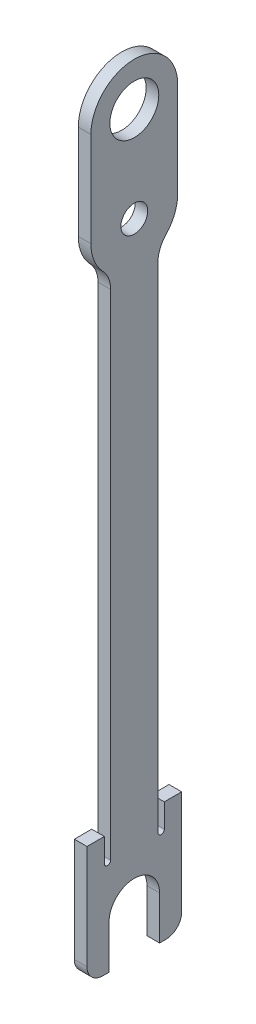
ISO-10303-21;
HEADER;
FILE_DESCRIPTION(('STEP AP214'),'2;1');
FILE_NAME('part.step','',(''),(''),'','','');
FILE_SCHEMA(('AUTOMOTIVE_DESIGN { 1 0 10303 214 1 1 1 1 }'));
ENDSEC;
DATA;
#1=APPLICATION_CONTEXT('core data for automotive mechanical design processes');
#2=APPLICATION_PROTOCOL_DEFINITION('international standard','automotive_design',2000,#1);
#3=PRODUCT_CONTEXT('',#1,'mechanical');
#4=PRODUCT('Part','Part','',(#3));
#5=PRODUCT_RELATED_PRODUCT_CATEGORY('part','',(#4));
#6=PRODUCT_DEFINITION_FORMATION('','',#4);
#7=PRODUCT_DEFINITION_CONTEXT('part definition',#1,'design');
#8=PRODUCT_DEFINITION('design','',#6,#7);
#9=PRODUCT_DEFINITION_SHAPE('','',#8);
#10=(LENGTH_UNIT() NAMED_UNIT(*) SI_UNIT(.MILLI.,.METRE.));
#11=(NAMED_UNIT(*) PLANE_ANGLE_UNIT() SI_UNIT($,.RADIAN.));
#12=(NAMED_UNIT(*) SI_UNIT($,.STERADIAN.) SOLID_ANGLE_UNIT());
#13=UNCERTAINTY_MEASURE_WITH_UNIT(LENGTH_MEASURE(1.E-05),#10,'distance_accuracy_value','');
#14=(GEOMETRIC_REPRESENTATION_CONTEXT(3) GLOBAL_UNCERTAINTY_ASSIGNED_CONTEXT((#13)) GLOBAL_UNIT_ASSIGNED_CONTEXT((#10,
#11,#12)) REPRESENTATION_CONTEXT('',''));
#15=CARTESIAN_POINT('',(0.,0.,0.));
#16=DIRECTION('',(0.,0.,1.));
#17=DIRECTION('',(1.,0.,0.));
#18=AXIS2_PLACEMENT_3D('',#15,#16,#17);
#19=CARTESIAN_POINT('',(0.800000000000043,12.43,1.5));
#20=DIRECTION('',(0.,0.,-1.));
#21=DIRECTION('',(1.,0.,0.));
#22=AXIS2_PLACEMENT_3D('',#19,#20,#21);
#23=PLANE('',#22);
#24=DIRECTION('',(0.,-1.,0.));
#25=VECTOR('',#24,1.);
#26=CARTESIAN_POINT('',(0.800000000000127,18.43,1.5));
#27=LINE('',#26,#25);
#28=CARTESIAN_POINT('',(0.800000000000251,36.6175089784646,1.5));
#29=VERTEX_POINT('',#28);
#30=CARTESIAN_POINT('',(0.8,5.3,1.5));
#31=VERTEX_POINT('',#30);
#32=EDGE_CURVE('E13',#29,#31,#27,.T.);
#33=ORIENTED_EDGE('',*,*,#32,.F.);
#34=DIRECTION('',(-1.,0.,0.));
#35=VECTOR('',#34,1.);
#36=CARTESIAN_POINT('',(2.4980018054066E-13,36.6175089784646,1.5));
#37=LINE('',#36,#35);
#38=CARTESIAN_POINT('',(2.4980018054066E-13,36.6175089784646,1.5));
#39=VERTEX_POINT('',#38);
#40=EDGE_CURVE('E457',#29,#39,#37,.T.);
#41=ORIENTED_EDGE('',*,*,#40,.T.);
#42=DIRECTION('',(0.,1.,0.));
#43=VECTOR('',#42,1.);
#44=CARTESIAN_POINT('',(0.,12.43,1.5));
#45=LINE('',#44,#43);
#46=CARTESIAN_POINT('',(0.,5.3,1.5));
#47=VERTEX_POINT('',#46);
#48=EDGE_CURVE('E257',#39,#47,#45,.F.);
#49=ORIENTED_EDGE('',*,*,#48,.T.);
#50=DIRECTION('',(1.,0.,0.));
#51=VECTOR('',#50,1.);
#52=CARTESIAN_POINT('',(0.,5.3,1.5));
#53=LINE('',#52,#51);
#54=EDGE_CURVE('E515',#47,#31,#53,.T.);
#55=ORIENTED_EDGE('',*,*,#54,.T.);
#56=EDGE_LOOP('',(#33,#41,#49,#55));
#57=FACE_BOUND('',#56,.T.);
#58=ADVANCED_FACE('F253',(#57),#23,.F.);
#59=CARTESIAN_POINT('',(0.800000000000127,18.43,0.));
#60=DIRECTION('',(-1.,0.,0.));
#61=DIRECTION('',(0.,-1.,0.));
#62=AXIS2_PLACEMENT_3D('',#59,#60,#61);
#63=PLANE('',#62);
#64=DIRECTION('',(0.,-1.,0.));
#65=VECTOR('',#64,1.);
#66=CARTESIAN_POINT('',(0.800000000000127,18.43,-1.5));
#67=LINE('',#66,#65);
#68=CARTESIAN_POINT('',(0.800000000000251,36.6175089784646,-1.5));
#69=VERTEX_POINT('',#68);
#70=CARTESIAN_POINT('',(0.8,5.3,-1.5));
#71=VERTEX_POINT('',#70);
#72=EDGE_CURVE('E270',#69,#71,#67,.T.);
#73=ORIENTED_EDGE('',*,*,#72,.F.);
#74=CARTESIAN_POINT('',(0.800000000000251,36.6175089784646,-3.3));
#75=DIRECTION('',(-1.,0.,0.));
#76=DIRECTION('',(0.,1.,0.));
#77=AXIS2_PLACEMENT_3D('',#74,#75,#76);
#78=CIRCLE('',#77,1.8);
#79=CARTESIAN_POINT('',(0.800000000000259,37.8567361957753,-1.99450549450549));
#80=VERTEX_POINT('',#79);
#81=EDGE_CURVE('E503',#80,#69,#78,.F.);
#82=ORIENTED_EDGE('',*,*,#81,.F.);
#83=CARTESIAN_POINT('',(0.800000000000272,39.75,0.));
#84=DIRECTION('',(-1.,0.,0.));
#85=DIRECTION('',(0.,1.,0.));
#86=AXIS2_PLACEMENT_3D('',#83,#84,#85);
#87=CIRCLE('',#86,2.75);
#88=CARTESIAN_POINT('',(0.800000000000282,39.75,-2.75));
#89=VERTEX_POINT('',#88);
#90=EDGE_CURVE('E490',#89,#80,#87,.T.);
#91=ORIENTED_EDGE('',*,*,#90,.F.);
#92=DIRECTION('',(0.,-1.,0.));
#93=VECTOR('',#92,1.);
#94=CARTESIAN_POINT('',(0.800000000000334,48.5,-2.74999999999999));
#95=LINE('',#94,#93);
#96=CARTESIAN_POINT('',(0.800000000000325,45.75,-2.75));
#97=VERTEX_POINT('',#96);
#98=EDGE_CURVE('E454',#89,#97,#95,.F.);
#99=ORIENTED_EDGE('',*,*,#98,.T.);
#100=CARTESIAN_POINT('',(0.800000000000314,45.75,0.));
#101=DIRECTION('',(1.,0.,0.));
#102=DIRECTION('',(0.,1.,0.));
#103=AXIS2_PLACEMENT_3D('',#100,#101,#102);
#104=CIRCLE('',#103,2.75);
#105=CARTESIAN_POINT('',(0.800000000000323,45.75,2.75));
#106=VERTEX_POINT('',#105);
#107=EDGE_CURVE('E451',#97,#106,#104,.T.);
#108=ORIENTED_EDGE('',*,*,#107,.T.);
#109=DIRECTION('',(0.,-1.,0.));
#110=VECTOR('',#109,1.);
#111=CARTESIAN_POINT('',(0.800000000000334,48.5,2.74999999999999));
#112=LINE('',#111,#110);
#113=CARTESIAN_POINT('',(0.80000000000028,39.75,2.75));
#114=VERTEX_POINT('',#113);
#115=EDGE_CURVE('E512',#114,#106,#112,.F.);
#116=ORIENTED_EDGE('',*,*,#115,.F.);
#117=CARTESIAN_POINT('',(0.800000000000272,39.75,0.));
#118=DIRECTION('',(1.,0.,0.));
#119=DIRECTION('',(0.,1.,0.));
#120=AXIS2_PLACEMENT_3D('',#117,#118,#119);
#121=CIRCLE('',#120,2.75);
#122=CARTESIAN_POINT('',(0.800000000000259,37.8567361957753,1.99450549450549));
#123=VERTEX_POINT('',#122);
#124=EDGE_CURVE('E319',#114,#123,#121,.T.);
#125=ORIENTED_EDGE('',*,*,#124,.T.);
#126=CARTESIAN_POINT('',(0.800000000000251,36.6175089784646,3.3));
#127=DIRECTION('',(1.,0.,0.));
#128=DIRECTION('',(0.,1.,0.));
#129=AXIS2_PLACEMENT_3D('',#126,#127,#128);
#130=CIRCLE('',#129,1.8);
#131=EDGE_CURVE('E446',#123,#29,#130,.F.);
#132=ORIENTED_EDGE('',*,*,#131,.T.);
#133=ORIENTED_EDGE('',*,*,#32,.T.);
#134=CARTESIAN_POINT('',(0.8,5.3,1.7));
#135=DIRECTION('',(-1.,0.,0.));
#136=DIRECTION('',(0.,0.,1.));
#137=AXIS2_PLACEMENT_3D('',#134,#135,#136);
#138=CIRCLE('',#137,0.2);
#139=CARTESIAN_POINT('',(0.8,5.3,1.9));
#140=VERTEX_POINT('',#139);
#141=EDGE_CURVE('E575',#140,#31,#138,.F.);
#142=ORIENTED_EDGE('',*,*,#141,.F.);
#143=DIRECTION('',(0.,-1.,0.));
#144=VECTOR('',#143,1.);
#145=CARTESIAN_POINT('',(0.8,-0.8,1.9));
#146=LINE('',#145,#144);
#147=CARTESIAN_POINT('',(0.8,6.8,1.9));
#148=VERTEX_POINT('',#147);
#149=EDGE_CURVE('E568',#148,#140,#146,.T.);
#150=ORIENTED_EDGE('',*,*,#149,.F.);
#151=DIRECTION('',(0.,0.,-1.));
#152=VECTOR('',#151,1.);
#153=CARTESIAN_POINT('',(0.8,6.8,3.));
#154=LINE('',#153,#152);
#155=CARTESIAN_POINT('',(0.8,6.8,3.));
#156=VERTEX_POINT('',#155);
#157=EDGE_CURVE('E563',#156,#148,#154,.T.);
#158=ORIENTED_EDGE('',*,*,#157,.F.);
#159=DIRECTION('',(0.,1.,0.));
#160=VECTOR('',#159,1.);
#161=CARTESIAN_POINT('',(0.8,-0.8,3.));
#162=LINE('',#161,#160);
#163=CARTESIAN_POINT('',(0.8,0.2,3.));
#164=VERTEX_POINT('',#163);
#165=EDGE_CURVE('E556',#164,#156,#162,.T.);
#166=ORIENTED_EDGE('',*,*,#165,.F.);
#167=CARTESIAN_POINT('',(0.8,0.2,2.));
#168=DIRECTION('',(-1.,0.,0.));
#169=DIRECTION('',(0.,0.,1.));
#170=AXIS2_PLACEMENT_3D('',#167,#168,#169);
#171=CIRCLE('',#170,1.);
#172=CARTESIAN_POINT('',(0.8,-0.8,2.));
#173=VERTEX_POINT('',#172);
#174=EDGE_CURVE('E618',#164,#173,#171,.F.);
#175=ORIENTED_EDGE('',*,*,#174,.T.);
#176=DIRECTION('',(0.,0.,-1.));
#177=VECTOR('',#176,1.);
#178=CARTESIAN_POINT('',(0.8,-0.8,3.));
#179=LINE('',#178,#177);
#180=CARTESIAN_POINT('',(0.8,-0.8,1.6));
#181=VERTEX_POINT('',#180);
#182=EDGE_CURVE('E442',#173,#181,#179,.T.);
#183=ORIENTED_EDGE('',*,*,#182,.T.);
#184=DIRECTION('',(0.,-1.,0.));
#185=VECTOR('',#184,1.);
#186=CARTESIAN_POINT('',(0.8,1.95000000000114,1.6));
#187=LINE('',#186,#185);
#188=CARTESIAN_POINT('',(0.8,1.95000000000114,1.6));
#189=VERTEX_POINT('',#188);
#190=EDGE_CURVE('E428',#189,#181,#187,.T.);
#191=ORIENTED_EDGE('',*,*,#190,.F.);
#192=CARTESIAN_POINT('',(0.8,1.95000000000114,0.));
#193=DIRECTION('',(1.,0.,0.));
#194=DIRECTION('',(0.,0.,-1.));
#195=AXIS2_PLACEMENT_3D('',#192,#193,#194);
#196=CIRCLE('',#195,1.6);
#197=CARTESIAN_POINT('',(0.8,1.95000000000114,-1.6));
#198=VERTEX_POINT('',#197);
#199=EDGE_CURVE('E331',#198,#189,#196,.T.);
#200=ORIENTED_EDGE('',*,*,#199,.F.);
#201=DIRECTION('',(0.,-1.,0.));
#202=VECTOR('',#201,1.);
#203=CARTESIAN_POINT('',(0.8,1.95000000000114,-1.6));
#204=LINE('',#203,#202);
#205=CARTESIAN_POINT('',(0.8,-0.8,-1.6));
#206=VERTEX_POINT('',#205);
#207=EDGE_CURVE('E621',#198,#206,#204,.T.);
#208=ORIENTED_EDGE('',*,*,#207,.T.);
#209=DIRECTION('',(0.,0.,1.));
#210=VECTOR('',#209,1.);
#211=CARTESIAN_POINT('',(0.8,-0.8,-3.));
#212=LINE('',#211,#210);
#213=CARTESIAN_POINT('',(0.8,-0.8,-2.));
#214=VERTEX_POINT('',#213);
#215=EDGE_CURVE('E600',#214,#206,#212,.T.);
#216=ORIENTED_EDGE('',*,*,#215,.F.);
#217=CARTESIAN_POINT('',(0.8,0.2,-2.));
#218=DIRECTION('',(1.,0.,0.));
#219=DIRECTION('',(0.,0.,-1.));
#220=AXIS2_PLACEMENT_3D('',#217,#218,#219);
#221=CIRCLE('',#220,1.);
#222=CARTESIAN_POINT('',(0.8,0.2,-3.));
#223=VERTEX_POINT('',#222);
#224=EDGE_CURVE('E597',#223,#214,#221,.F.);
#225=ORIENTED_EDGE('',*,*,#224,.F.);
#226=DIRECTION('',(0.,1.,0.));
#227=VECTOR('',#226,1.);
#228=CARTESIAN_POINT('',(0.8,-0.8,-3.));
#229=LINE('',#228,#227);
#230=CARTESIAN_POINT('',(0.8,6.8,-3.));
#231=VERTEX_POINT('',#230);
#232=EDGE_CURVE('E623',#223,#231,#229,.T.);
#233=ORIENTED_EDGE('',*,*,#232,.T.);
#234=DIRECTION('',(0.,0.,1.));
#235=VECTOR('',#234,1.);
#236=CARTESIAN_POINT('',(0.8,6.8,-3.));
#237=LINE('',#236,#235);
#238=CARTESIAN_POINT('',(0.8,6.8,-1.9));
#239=VERTEX_POINT('',#238);
#240=EDGE_CURVE('E626',#231,#239,#237,.T.);
#241=ORIENTED_EDGE('',*,*,#240,.T.);
#242=DIRECTION('',(0.,-1.,0.));
#243=VECTOR('',#242,1.);
#244=CARTESIAN_POINT('',(0.8,-0.8,-1.9));
#245=LINE('',#244,#243);
#246=CARTESIAN_POINT('',(0.8,5.3,-1.9));
#247=VERTEX_POINT('',#246);
#248=EDGE_CURVE('E629',#239,#247,#245,.T.);
#249=ORIENTED_EDGE('',*,*,#248,.T.);
#250=CARTESIAN_POINT('',(0.8,5.3,-1.7));
#251=DIRECTION('',(1.,0.,0.));
#252=DIRECTION('',(0.,0.,-1.));
#253=AXIS2_PLACEMENT_3D('',#250,#251,#252);
#254=CIRCLE('',#253,0.2);
#255=EDGE_CURVE('E632',#247,#71,#254,.F.);
#256=ORIENTED_EDGE('',*,*,#255,.T.);
#257=EDGE_LOOP('',(#73,#82,#91,#99,#108,#116,#125,#132,#133,#142,#150,#158,#166,#175,#183,#191,
#200,#208,#216,#225,#233,#241,#249,#256));
#258=FACE_BOUND('',#257,.T.);
#259=CARTESIAN_POINT('',(0.800000000000272,39.75,0.));
#260=DIRECTION('',(1.,0.,0.));
#261=DIRECTION('',(0.,1.,0.));
#262=AXIS2_PLACEMENT_3D('',#259,#260,#261);
#263=CIRCLE('',#262,0.85);
#264=CARTESIAN_POINT('',(0.800000000000278,40.6,0.));
#265=VERTEX_POINT('',#264);
#266=EDGE_CURVE('E469',#265,#265,#263,.T.);
#267=ORIENTED_EDGE('',*,*,#266,.F.);
#268=EDGE_LOOP('',(#267));
#269=FACE_BOUND('',#268,.T.);
#270=CARTESIAN_POINT('',(0.800000000000314,45.75,0.));
#271=DIRECTION('',(1.,0.,0.));
#272=DIRECTION('',(0.,1.,0.));
#273=AXIS2_PLACEMENT_3D('',#270,#271,#272);
#274=CIRCLE('',#273,1.55);
#275=CARTESIAN_POINT('',(0.800000000000325,47.3,0.));
#276=VERTEX_POINT('',#275);
#277=EDGE_CURVE('E475',#276,#276,#274,.T.);
#278=ORIENTED_EDGE('',*,*,#277,.F.);
#279=EDGE_LOOP('',(#278));
#280=FACE_BOUND('',#279,.T.);
#281=ADVANCED_FACE('F439',(#258,#269,#280),#63,.F.);
#282=CARTESIAN_POINT('',(0.,-0.8,3.));
#283=DIRECTION('',(-1.,0.,0.));
#284=DIRECTION('',(0.,0.,1.));
#285=AXIS2_PLACEMENT_3D('',#282,#283,#284);
#286=PLANE('',#285);
#287=ORIENTED_EDGE('',*,*,#48,.F.);
#288=CARTESIAN_POINT('',(2.4980018054066E-13,36.6175089784646,3.3));
#289=DIRECTION('',(1.,0.,0.));
#290=DIRECTION('',(0.,1.,0.));
#291=AXIS2_PLACEMENT_3D('',#288,#289,#290);
#292=CIRCLE('',#291,1.8);
#293=CARTESIAN_POINT('',(2.58473797920544E-13,37.8567361957753,1.99450549450549));
#294=VERTEX_POINT('',#293);
#295=EDGE_CURVE('E465',#39,#294,#292,.T.);
#296=ORIENTED_EDGE('',*,*,#295,.T.);
#297=CARTESIAN_POINT('',(2.7148422399037E-13,39.75,0.));
#298=DIRECTION('',(-1.,0.,0.));
#299=DIRECTION('',(0.,-1.,0.));
#300=AXIS2_PLACEMENT_3D('',#297,#298,#299);
#301=CIRCLE('',#300,2.75);
#302=CARTESIAN_POINT('',(2.7148422399037E-13,39.75,2.75));
#303=VERTEX_POINT('',#302);
#304=EDGE_CURVE('E463',#294,#303,#301,.T.);
#305=ORIENTED_EDGE('',*,*,#304,.T.);
#306=DIRECTION('',(0.,1.,0.));
#307=VECTOR('',#306,1.);
#308=CARTESIAN_POINT('',(0.,9.39999999999996,2.75));
#309=LINE('',#308,#307);
#310=CARTESIAN_POINT('',(3.13984949151802E-13,45.75,2.74999999999999));
#311=VERTEX_POINT('',#310);
#312=EDGE_CURVE('E460',#303,#311,#309,.T.);
#313=ORIENTED_EDGE('',*,*,#312,.T.);
#314=CARTESIAN_POINT('',(3.13984949151802E-13,45.75,0.));
#315=DIRECTION('',(-1.,0.,0.));
#316=DIRECTION('',(0.,-1.,0.));
#317=AXIS2_PLACEMENT_3D('',#314,#315,#316);
#318=CIRCLE('',#317,2.75);
#319=CARTESIAN_POINT('',(3.13984949151802E-13,45.75,-2.74999999999999));
#320=VERTEX_POINT('',#319);
#321=EDGE_CURVE('E467',#311,#320,#318,.T.);
#322=ORIENTED_EDGE('',*,*,#321,.T.);
#323=DIRECTION('',(0.,1.,0.));
#324=VECTOR('',#323,1.);
#325=CARTESIAN_POINT('',(0.,9.39999999999996,-2.75));
#326=LINE('',#325,#324);
#327=CARTESIAN_POINT('',(2.7148422399037E-13,39.75,-2.74999999999999));
#328=VERTEX_POINT('',#327);
#329=EDGE_CURVE('E484',#328,#320,#326,.T.);
#330=ORIENTED_EDGE('',*,*,#329,.F.);
#331=CARTESIAN_POINT('',(2.7148422399037E-13,39.75,0.));
#332=DIRECTION('',(1.,0.,0.));
#333=DIRECTION('',(0.,-1.,0.));
#334=AXIS2_PLACEMENT_3D('',#331,#332,#333);
#335=CIRCLE('',#334,2.75);
#336=CARTESIAN_POINT('',(2.58473797920544E-13,37.8567361957753,-1.99450549450549));
#337=VERTEX_POINT('',#336);
#338=EDGE_CURVE('E493',#337,#328,#335,.T.);
#339=ORIENTED_EDGE('',*,*,#338,.F.);
#340=CARTESIAN_POINT('',(2.50667542278649E-13,36.6175089784646,-3.3));
#341=DIRECTION('',(-1.,0.,0.));
#342=DIRECTION('',(0.,1.,0.));
#343=AXIS2_PLACEMENT_3D('',#340,#341,#342);
#344=CIRCLE('',#343,1.8);
#345=CARTESIAN_POINT('',(2.4980018054066E-13,36.6175089784646,-1.5));
#346=VERTEX_POINT('',#345);
#347=EDGE_CURVE('E497',#346,#337,#344,.T.);
#348=ORIENTED_EDGE('',*,*,#347,.F.);
#349=DIRECTION('',(0.,1.,0.));
#350=VECTOR('',#349,1.);
#351=CARTESIAN_POINT('',(0.,12.43,-1.5));
#352=LINE('',#351,#350);
#353=CARTESIAN_POINT('',(0.,5.3,-1.5));
#354=VERTEX_POINT('',#353);
#355=EDGE_CURVE('E449',#346,#354,#352,.F.);
#356=ORIENTED_EDGE('',*,*,#355,.T.);
#357=CARTESIAN_POINT('',(0.,5.3,-1.7));
#358=DIRECTION('',(1.,0.,0.));
#359=DIRECTION('',(0.,0.,-1.));
#360=AXIS2_PLACEMENT_3D('',#357,#358,#359);
#361=CIRCLE('',#360,0.2);
#362=CARTESIAN_POINT('',(0.,5.3,-1.9));
#363=VERTEX_POINT('',#362);
#364=EDGE_CURVE('E523',#354,#363,#361,.T.);
#365=ORIENTED_EDGE('',*,*,#364,.T.);
#366=DIRECTION('',(0.,1.,0.));
#367=VECTOR('',#366,1.);
#368=CARTESIAN_POINT('',(0.,5.3,-1.9));
#369=LINE('',#368,#367);
#370=CARTESIAN_POINT('',(0.,6.8,-1.9));
#371=VERTEX_POINT('',#370);
#372=EDGE_CURVE('E536',#363,#371,#369,.T.);
#373=ORIENTED_EDGE('',*,*,#372,.T.);
#374=DIRECTION('',(0.,0.,1.));
#375=VECTOR('',#374,1.);
#376=CARTESIAN_POINT('',(0.,6.8,-3.));
#377=LINE('',#376,#375);
#378=CARTESIAN_POINT('',(0.,6.8,-3.));
#379=VERTEX_POINT('',#378);
#380=EDGE_CURVE('E583',#379,#371,#377,.T.);
#381=ORIENTED_EDGE('',*,*,#380,.F.);
#382=DIRECTION('',(0.,1.,0.));
#383=VECTOR('',#382,1.);
#384=CARTESIAN_POINT('',(0.,-0.8,-3.));
#385=LINE('',#384,#383);
#386=CARTESIAN_POINT('',(0.,0.2,-3.));
#387=VERTEX_POINT('',#386);
#388=EDGE_CURVE('E588',#387,#379,#385,.T.);
#389=ORIENTED_EDGE('',*,*,#388,.F.);
#390=CARTESIAN_POINT('',(0.,0.2,-2.));
#391=DIRECTION('',(1.,0.,0.));
#392=DIRECTION('',(0.,0.,-1.));
#393=AXIS2_PLACEMENT_3D('',#390,#391,#392);
#394=CIRCLE('',#393,1.);
#395=CARTESIAN_POINT('',(0.,-0.8,-2.));
#396=VERTEX_POINT('',#395);
#397=EDGE_CURVE('E592',#396,#387,#394,.T.);
#398=ORIENTED_EDGE('',*,*,#397,.F.);
#399=DIRECTION('',(0.,0.,1.));
#400=VECTOR('',#399,1.);
#401=CARTESIAN_POINT('',(0.,-0.8,-3.));
#402=LINE('',#401,#400);
#403=CARTESIAN_POINT('',(0.,-0.8,-1.6));
#404=VERTEX_POINT('',#403);
#405=EDGE_CURVE('E539',#396,#404,#402,.T.);
#406=ORIENTED_EDGE('',*,*,#405,.T.);
#407=DIRECTION('',(0.,-1.,0.));
#408=VECTOR('',#407,1.);
#409=CARTESIAN_POINT('',(0.,1.95000000000114,-1.6));
#410=LINE('',#409,#408);
#411=CARTESIAN_POINT('',(0.,1.95000000000114,-1.6));
#412=VERTEX_POINT('',#411);
#413=EDGE_CURVE('E437',#412,#404,#410,.T.);
#414=ORIENTED_EDGE('',*,*,#413,.F.);
#415=CARTESIAN_POINT('',(0.,1.95000000000114,0.));
#416=DIRECTION('',(-1.,0.,0.));
#417=DIRECTION('',(0.,0.,1.));
#418=AXIS2_PLACEMENT_3D('',#415,#416,#417);
#419=CIRCLE('',#418,1.6);
#420=CARTESIAN_POINT('',(0.,1.95000000000114,1.6));
#421=VERTEX_POINT('',#420);
#422=EDGE_CURVE('E614',#412,#421,#419,.F.);
#423=ORIENTED_EDGE('',*,*,#422,.T.);
#424=DIRECTION('',(0.,-1.,0.));
#425=VECTOR('',#424,1.);
#426=CARTESIAN_POINT('',(0.,1.95000000000114,1.6));
#427=LINE('',#426,#425);
#428=CARTESIAN_POINT('',(0.,-0.8,1.6));
#429=VERTEX_POINT('',#428);
#430=EDGE_CURVE('E423',#421,#429,#427,.T.);
#431=ORIENTED_EDGE('',*,*,#430,.T.);
#432=DIRECTION('',(0.,0.,-1.));
#433=VECTOR('',#432,1.);
#434=CARTESIAN_POINT('',(0.,-0.8,3.));
#435=LINE('',#434,#433);
#436=CARTESIAN_POINT('',(0.,-0.8,2.));
#437=VERTEX_POINT('',#436);
#438=EDGE_CURVE('E551',#437,#429,#435,.T.);
#439=ORIENTED_EDGE('',*,*,#438,.F.);
#440=CARTESIAN_POINT('',(0.,0.2,2.));
#441=DIRECTION('',(-1.,0.,0.));
#442=DIRECTION('',(0.,0.,1.));
#443=AXIS2_PLACEMENT_3D('',#440,#441,#442);
#444=CIRCLE('',#443,1.);
#445=CARTESIAN_POINT('',(0.,0.2,3.));
#446=VERTEX_POINT('',#445);
#447=EDGE_CURVE('E547',#437,#446,#444,.T.);
#448=ORIENTED_EDGE('',*,*,#447,.T.);
#449=DIRECTION('',(0.,1.,0.));
#450=VECTOR('',#449,1.);
#451=CARTESIAN_POINT('',(0.,-0.8,3.));
#452=LINE('',#451,#450);
#453=CARTESIAN_POINT('',(0.,6.8,3.));
#454=VERTEX_POINT('',#453);
#455=EDGE_CURVE('E542',#446,#454,#452,.T.);
#456=ORIENTED_EDGE('',*,*,#455,.T.);
#457=DIRECTION('',(0.,0.,-1.));
#458=VECTOR('',#457,1.);
#459=CARTESIAN_POINT('',(0.,6.8,3.));
#460=LINE('',#459,#458);
#461=CARTESIAN_POINT('',(0.,6.8,1.9));
#462=VERTEX_POINT('',#461);
#463=EDGE_CURVE('E537',#454,#462,#460,.T.);
#464=ORIENTED_EDGE('',*,*,#463,.T.);
#465=DIRECTION('',(0.,1.,0.));
#466=VECTOR('',#465,1.);
#467=CARTESIAN_POINT('',(0.,5.3,1.9));
#468=LINE('',#467,#466);
#469=CARTESIAN_POINT('',(0.,5.3,1.9));
#470=VERTEX_POINT('',#469);
#471=EDGE_CURVE('E566',#470,#462,#468,.T.);
#472=ORIENTED_EDGE('',*,*,#471,.F.);
#473=CARTESIAN_POINT('',(0.,5.3,1.7));
#474=DIRECTION('',(-1.,0.,0.));
#475=DIRECTION('',(0.,0.,1.));
#476=AXIS2_PLACEMENT_3D('',#473,#474,#475);
#477=CIRCLE('',#476,0.2);
#478=EDGE_CURVE('E572',#47,#470,#477,.T.);
#479=ORIENTED_EDGE('',*,*,#478,.F.);
#480=EDGE_LOOP('',(#287,#296,#305,#313,#322,#330,#339,#348,#356,#365,#373,#381,#389,#398,#406,
#414,#423,#431,#439,#448,#456,#464,#472,#479));
#481=FACE_BOUND('',#480,.T.);
#482=CARTESIAN_POINT('',(2.7148422399037E-13,39.75,0.));
#483=DIRECTION('',(-1.,0.,0.));
#484=DIRECTION('',(0.,-1.,0.));
#485=AXIS2_PLACEMENT_3D('',#482,#483,#484);
#486=CIRCLE('',#485,0.85);
#487=CARTESIAN_POINT('',(2.65543720636722E-13,38.9,0.));
#488=VERTEX_POINT('',#487);
#489=EDGE_CURVE('E472',#488,#488,#486,.T.);
#490=ORIENTED_EDGE('',*,*,#489,.F.);
#491=EDGE_LOOP('',(#490));
#492=FACE_BOUND('',#491,.T.);
#493=CARTESIAN_POINT('',(3.13984949151802E-13,45.75,0.));
#494=DIRECTION('',(-1.,0.,0.));
#495=DIRECTION('',(0.,-1.,0.));
#496=AXIS2_PLACEMENT_3D('',#493,#494,#495);
#497=CIRCLE('',#496,1.55);
#498=CARTESIAN_POINT('',(3.03152266565738E-13,44.2,0.));
#499=VERTEX_POINT('',#498);
#500=EDGE_CURVE('E478',#499,#499,#497,.T.);
#501=ORIENTED_EDGE('',*,*,#500,.F.);
#502=EDGE_LOOP('',(#501));
#503=FACE_BOUND('',#502,.T.);
#504=ADVANCED_FACE('F255',(#481,#492,#503),#286,.T.);
#505=CARTESIAN_POINT('',(0.800000000000043,12.43,-1.5));
#506=DIRECTION('',(0.,0.,1.));
#507=DIRECTION('',(1.,0.,0.));
#508=AXIS2_PLACEMENT_3D('',#505,#506,#507);
#509=PLANE('',#508);
#510=ORIENTED_EDGE('',*,*,#355,.F.);
#511=DIRECTION('',(-1.,0.,0.));
#512=VECTOR('',#511,1.);
#513=CARTESIAN_POINT('',(2.50667542278649E-13,36.6175089784646,-1.5));
#514=LINE('',#513,#512);
#515=EDGE_CURVE('E500',#69,#346,#514,.T.);
#516=ORIENTED_EDGE('',*,*,#515,.F.);
#517=ORIENTED_EDGE('',*,*,#72,.T.);
#518=DIRECTION('',(1.,0.,0.));
#519=VECTOR('',#518,1.);
#520=CARTESIAN_POINT('',(0.,5.3,-1.5));
#521=LINE('',#520,#519);
#522=EDGE_CURVE('E527',#354,#71,#521,.T.);
#523=ORIENTED_EDGE('',*,*,#522,.F.);
#524=EDGE_LOOP('',(#510,#516,#517,#523));
#525=FACE_BOUND('',#524,.T.);
#526=ADVANCED_FACE('F528',(#525),#509,.F.);
#527=CARTESIAN_POINT('',(3.33066907387547E-13,48.5,2.74999999999999));
#528=DIRECTION('',(0.,0.,-1.));
#529=DIRECTION('',(0.,1.,0.));
#530=AXIS2_PLACEMENT_3D('',#527,#528,#529);
#531=PLANE('',#530);
#532=ORIENTED_EDGE('',*,*,#115,.T.);
#533=DIRECTION('',(-1.,0.,0.));
#534=VECTOR('',#533,1.);
#535=CARTESIAN_POINT('',(7.00000000000034,45.75,2.75));
#536=LINE('',#535,#534);
#537=EDGE_CURVE('E509',#106,#311,#536,.T.);
#538=ORIENTED_EDGE('',*,*,#537,.T.);
#539=ORIENTED_EDGE('',*,*,#312,.F.);
#540=DIRECTION('',(-1.,0.,0.));
#541=VECTOR('',#540,1.);
#542=CARTESIAN_POINT('',(7.0000000000003,39.75,2.75));
#543=LINE('',#542,#541);
#544=EDGE_CURVE('E506',#114,#303,#543,.T.);
#545=ORIENTED_EDGE('',*,*,#544,.F.);
#546=EDGE_LOOP('',(#532,#538,#539,#545));
#547=FACE_BOUND('',#546,.T.);
#548=ADVANCED_FACE('F662',(#547),#531,.F.);
#549=CARTESIAN_POINT('',(7.0000000000003,39.75,0.));
#550=DIRECTION('',(-1.,0.,0.));
#551=DIRECTION('',(0.,-1.,0.));
#552=AXIS2_PLACEMENT_3D('',#549,#550,#551);
#553=CYLINDRICAL_SURFACE('',#552,2.75);
#554=ORIENTED_EDGE('',*,*,#304,.F.);
#555=DIRECTION('',(-1.,0.,0.));
#556=VECTOR('',#555,1.);
#557=CARTESIAN_POINT('',(7.00000000000029,37.8567361957753,1.99450549450549));
#558=LINE('',#557,#556);
#559=EDGE_CURVE('E324',#294,#123,#558,.F.);
#560=ORIENTED_EDGE('',*,*,#559,.T.);
#561=ORIENTED_EDGE('',*,*,#124,.F.);
#562=ORIENTED_EDGE('',*,*,#544,.T.);
#563=EDGE_LOOP('',(#554,#560,#561,#562));
#564=FACE_BOUND('',#563,.T.);
#565=ADVANCED_FACE('F659',(#564),#553,.T.);
#566=CARTESIAN_POINT('',(7.00000000000028,36.6175089784645,3.3));
#567=DIRECTION('',(-1.,0.,0.));
#568=DIRECTION('',(0.,-1.,0.));
#569=AXIS2_PLACEMENT_3D('',#566,#567,#568);
#570=CYLINDRICAL_SURFACE('',#569,1.8);
#571=ORIENTED_EDGE('',*,*,#131,.F.);
#572=ORIENTED_EDGE('',*,*,#559,.F.);
#573=ORIENTED_EDGE('',*,*,#295,.F.);
#574=ORIENTED_EDGE('',*,*,#40,.F.);
#575=EDGE_LOOP('',(#571,#572,#573,#574));
#576=FACE_BOUND('',#575,.T.);
#577=ADVANCED_FACE('F658',(#576),#570,.F.);
#578=CARTESIAN_POINT('',(7.00000000000028,36.6175089784645,-3.3));
#579=DIRECTION('',(-1.,0.,0.));
#580=DIRECTION('',(0.,-1.,0.));
#581=AXIS2_PLACEMENT_3D('',#578,#579,#580);
#582=CYLINDRICAL_SURFACE('',#581,1.8);
#583=ORIENTED_EDGE('',*,*,#81,.T.);
#584=ORIENTED_EDGE('',*,*,#515,.T.);
#585=ORIENTED_EDGE('',*,*,#347,.T.);
#586=DIRECTION('',(-1.,0.,0.));
#587=VECTOR('',#586,1.);
#588=CARTESIAN_POINT('',(7.00000000000029,37.8567361957753,-1.99450549450549));
#589=LINE('',#588,#587);
#590=EDGE_CURVE('E495',#337,#80,#589,.F.);
#591=ORIENTED_EDGE('',*,*,#590,.T.);
#592=EDGE_LOOP('',(#583,#584,#585,#591));
#593=FACE_BOUND('',#592,.T.);
#594=ADVANCED_FACE('F674',(#593),#582,.F.);
#595=CARTESIAN_POINT('',(7.0000000000003,39.75,0.));
#596=DIRECTION('',(-1.,0.,0.));
#597=DIRECTION('',(0.,-1.,0.));
#598=AXIS2_PLACEMENT_3D('',#595,#596,#597);
#599=CYLINDRICAL_SURFACE('',#598,2.75);
#600=ORIENTED_EDGE('',*,*,#338,.T.);
#601=DIRECTION('',(-1.,0.,0.));
#602=VECTOR('',#601,1.);
#603=CARTESIAN_POINT('',(7.0000000000003,39.75,-2.75));
#604=LINE('',#603,#602);
#605=EDGE_CURVE('E487',#89,#328,#604,.T.);
#606=ORIENTED_EDGE('',*,*,#605,.F.);
#607=ORIENTED_EDGE('',*,*,#90,.T.);
#608=ORIENTED_EDGE('',*,*,#590,.F.);
#609=EDGE_LOOP('',(#600,#606,#607,#608));
#610=FACE_BOUND('',#609,.T.);
#611=ADVANCED_FACE('F672',(#610),#599,.T.);
#612=CARTESIAN_POINT('',(3.33934269125535E-13,48.5,-2.74999999999999));
#613=DIRECTION('',(0.,0.,1.));
#614=DIRECTION('',(0.,1.,0.));
#615=AXIS2_PLACEMENT_3D('',#612,#613,#614);
#616=PLANE('',#615);
#617=ORIENTED_EDGE('',*,*,#98,.F.);
#618=ORIENTED_EDGE('',*,*,#605,.T.);
#619=ORIENTED_EDGE('',*,*,#329,.T.);
#620=DIRECTION('',(-1.,0.,0.));
#621=VECTOR('',#620,1.);
#622=CARTESIAN_POINT('',(7.00000000000034,45.75,-2.75));
#623=LINE('',#622,#621);
#624=EDGE_CURVE('E481',#97,#320,#623,.T.);
#625=ORIENTED_EDGE('',*,*,#624,.F.);
#626=EDGE_LOOP('',(#617,#618,#619,#625));
#627=FACE_BOUND('',#626,.T.);
#628=ADVANCED_FACE('F669',(#627),#616,.F.);
#629=CARTESIAN_POINT('',(7.00000000000034,45.75,0.));
#630=DIRECTION('',(-1.,0.,0.));
#631=DIRECTION('',(0.,-1.,0.));
#632=AXIS2_PLACEMENT_3D('',#629,#630,#631);
#633=CYLINDRICAL_SURFACE('',#632,2.75);
#634=ORIENTED_EDGE('',*,*,#107,.F.);
#635=ORIENTED_EDGE('',*,*,#624,.T.);
#636=ORIENTED_EDGE('',*,*,#321,.F.);
#637=ORIENTED_EDGE('',*,*,#537,.F.);
#638=EDGE_LOOP('',(#634,#635,#636,#637));
#639=FACE_BOUND('',#638,.T.);
#640=ADVANCED_FACE('F666',(#639),#633,.T.);
#641=CARTESIAN_POINT('',(7.00000000000034,45.75,0.));
#642=DIRECTION('',(-1.,0.,0.));
#643=DIRECTION('',(0.,-1.,0.));
#644=AXIS2_PLACEMENT_3D('',#641,#642,#643);
#645=CYLINDRICAL_SURFACE('',#644,1.55);
#646=ORIENTED_EDGE('',*,*,#500,.T.);
#647=EDGE_LOOP('',(#646));
#648=FACE_BOUND('',#647,.T.);
#649=ORIENTED_EDGE('',*,*,#277,.T.);
#650=EDGE_LOOP('',(#649));
#651=FACE_BOUND('',#650,.T.);
#652=ADVANCED_FACE('F694',(#648,#651),#645,.F.);
#653=CARTESIAN_POINT('',(7.0000000000003,39.75,0.));
#654=DIRECTION('',(-1.,0.,0.));
#655=DIRECTION('',(0.,-1.,0.));
#656=AXIS2_PLACEMENT_3D('',#653,#654,#655);
#657=CYLINDRICAL_SURFACE('',#656,0.85);
#658=ORIENTED_EDGE('',*,*,#489,.T.);
#659=EDGE_LOOP('',(#658));
#660=FACE_BOUND('',#659,.T.);
#661=ORIENTED_EDGE('',*,*,#266,.T.);
#662=EDGE_LOOP('',(#661));
#663=FACE_BOUND('',#662,.T.);
#664=ADVANCED_FACE('F691',(#660,#663),#657,.F.);
#665=CARTESIAN_POINT('',(-39.101,1.95000000000114,1.6));
#666=DIRECTION('',(0.,0.,1.));
#667=DIRECTION('',(0.,-1.,0.));
#668=AXIS2_PLACEMENT_3D('',#665,#666,#667);
#669=PLANE('',#668);
#670=DIRECTION('',(1.,0.,0.));
#671=VECTOR('',#670,1.);
#672=CARTESIAN_POINT('',(-39.101,1.95000000000114,1.6));
#673=LINE('',#672,#671);
#674=EDGE_CURVE('E426',#421,#189,#673,.T.);
#675=ORIENTED_EDGE('',*,*,#674,.T.);
#676=ORIENTED_EDGE('',*,*,#190,.T.);
#677=DIRECTION('',(1.,0.,0.));
#678=VECTOR('',#677,1.);
#679=CARTESIAN_POINT('',(-39.101,-0.8,1.6));
#680=LINE('',#679,#678);
#681=EDGE_CURVE('E549',#429,#181,#680,.T.);
#682=ORIENTED_EDGE('',*,*,#681,.F.);
#683=ORIENTED_EDGE('',*,*,#430,.F.);
#684=EDGE_LOOP('',(#675,#676,#682,#683));
#685=FACE_BOUND('',#684,.T.);
#686=ADVANCED_FACE('F427',(#685),#669,.F.);
#687=CARTESIAN_POINT('',(-39.101,1.95000000000114,0.));
#688=DIRECTION('',(1.,0.,0.));
#689=DIRECTION('',(0.,0.,-1.));
#690=AXIS2_PLACEMENT_3D('',#687,#688,#689);
#691=CYLINDRICAL_SURFACE('',#690,1.6);
#692=ORIENTED_EDGE('',*,*,#422,.F.);
#693=DIRECTION('',(1.,0.,0.));
#694=VECTOR('',#693,1.);
#695=CARTESIAN_POINT('',(-39.101,1.95000000000114,-1.6));
#696=LINE('',#695,#694);
#697=EDGE_CURVE('E435',#412,#198,#696,.T.);
#698=ORIENTED_EDGE('',*,*,#697,.T.);
#699=ORIENTED_EDGE('',*,*,#199,.T.);
#700=ORIENTED_EDGE('',*,*,#674,.F.);
#701=EDGE_LOOP('',(#692,#698,#699,#700));
#702=FACE_BOUND('',#701,.T.);
#703=ADVANCED_FACE('F433',(#702),#691,.F.);
#704=CARTESIAN_POINT('',(-39.101,1.95000000000114,-1.6));
#705=DIRECTION('',(0.,0.,-1.));
#706=DIRECTION('',(0.,-1.,0.));
#707=AXIS2_PLACEMENT_3D('',#704,#705,#706);
#708=PLANE('',#707);
#709=ORIENTED_EDGE('',*,*,#697,.F.);
#710=ORIENTED_EDGE('',*,*,#413,.T.);
#711=DIRECTION('',(1.,0.,0.));
#712=VECTOR('',#711,1.);
#713=CARTESIAN_POINT('',(-39.101,-0.8,-1.6));
#714=LINE('',#713,#712);
#715=EDGE_CURVE('E603',#404,#206,#714,.T.);
#716=ORIENTED_EDGE('',*,*,#715,.T.);
#717=ORIENTED_EDGE('',*,*,#207,.F.);
#718=EDGE_LOOP('',(#709,#710,#716,#717));
#719=FACE_BOUND('',#718,.T.);
#720=ADVANCED_FACE('F609',(#719),#708,.F.);
#721=CARTESIAN_POINT('',(0.8,-0.8,-3.));
#722=DIRECTION('',(0.,-1.,0.));
#723=DIRECTION('',(0.,0.,1.));
#724=AXIS2_PLACEMENT_3D('',#721,#722,#723);
#725=PLANE('',#724);
#726=ORIENTED_EDGE('',*,*,#215,.T.);
#727=ORIENTED_EDGE('',*,*,#715,.F.);
#728=ORIENTED_EDGE('',*,*,#405,.F.);
#729=DIRECTION('',(-1.,0.,0.));
#730=VECTOR('',#729,1.);
#731=CARTESIAN_POINT('',(0.,-0.8,-2.));
#732=LINE('',#731,#730);
#733=EDGE_CURVE('E595',#214,#396,#732,.T.);
#734=ORIENTED_EDGE('',*,*,#733,.F.);
#735=EDGE_LOOP('',(#726,#727,#728,#734));
#736=FACE_BOUND('',#735,.T.);
#737=ADVANCED_FACE('F736',(#736),#725,.T.);
#738=CARTESIAN_POINT('',(0.8,0.2,-2.));
#739=DIRECTION('',(1.,0.,0.));
#740=DIRECTION('',(0.,0.,1.));
#741=AXIS2_PLACEMENT_3D('',#738,#739,#740);
#742=CYLINDRICAL_SURFACE('',#741,1.);
#743=ORIENTED_EDGE('',*,*,#224,.T.);
#744=ORIENTED_EDGE('',*,*,#733,.T.);
#745=ORIENTED_EDGE('',*,*,#397,.T.);
#746=DIRECTION('',(-1.,0.,0.));
#747=VECTOR('',#746,1.);
#748=CARTESIAN_POINT('',(0.8,0.2,-3.));
#749=LINE('',#748,#747);
#750=EDGE_CURVE('E590',#387,#223,#749,.F.);
#751=ORIENTED_EDGE('',*,*,#750,.T.);
#752=EDGE_LOOP('',(#743,#744,#745,#751));
#753=FACE_BOUND('',#752,.T.);
#754=ADVANCED_FACE('F743',(#753),#742,.T.);
#755=CARTESIAN_POINT('',(0.,0.,-3.));
#756=DIRECTION('',(0.,0.,1.));
#757=DIRECTION('',(-1.,0.,0.));
#758=AXIS2_PLACEMENT_3D('',#755,#756,#757);
#759=PLANE('',#758);
#760=ORIENTED_EDGE('',*,*,#388,.T.);
#761=DIRECTION('',(1.,0.,0.));
#762=VECTOR('',#761,1.);
#763=CARTESIAN_POINT('',(0.,6.8,-3.));
#764=LINE('',#763,#762);
#765=EDGE_CURVE('E586',#379,#231,#764,.T.);
#766=ORIENTED_EDGE('',*,*,#765,.T.);
#767=ORIENTED_EDGE('',*,*,#232,.F.);
#768=ORIENTED_EDGE('',*,*,#750,.F.);
#769=EDGE_LOOP('',(#760,#766,#767,#768));
#770=FACE_BOUND('',#769,.T.);
#771=ADVANCED_FACE('F750',(#770),#759,.F.);
#772=CARTESIAN_POINT('',(0.,6.8,-3.));
#773=DIRECTION('',(0.,1.,0.));
#774=DIRECTION('',(-1.,0.,0.));
#775=AXIS2_PLACEMENT_3D('',#772,#773,#774);
#776=PLANE('',#775);
#777=ORIENTED_EDGE('',*,*,#240,.F.);
#778=ORIENTED_EDGE('',*,*,#765,.F.);
#779=ORIENTED_EDGE('',*,*,#380,.T.);
#780=DIRECTION('',(1.,0.,0.));
#781=VECTOR('',#780,1.);
#782=CARTESIAN_POINT('',(0.,6.8,-1.9));
#783=LINE('',#782,#781);
#784=EDGE_CURVE('E581',#371,#239,#783,.T.);
#785=ORIENTED_EDGE('',*,*,#784,.T.);
#786=EDGE_LOOP('',(#777,#778,#779,#785));
#787=FACE_BOUND('',#786,.T.);
#788=ADVANCED_FACE('F758',(#787),#776,.T.);
#789=CARTESIAN_POINT('',(0.,5.3,-1.9));
#790=DIRECTION('',(0.,0.,1.));
#791=DIRECTION('',(-1.,0.,0.));
#792=AXIS2_PLACEMENT_3D('',#789,#790,#791);
#793=PLANE('',#792);
#794=ORIENTED_EDGE('',*,*,#784,.F.);
#795=ORIENTED_EDGE('',*,*,#372,.F.);
#796=DIRECTION('',(1.,0.,0.));
#797=VECTOR('',#796,1.);
#798=CARTESIAN_POINT('',(0.,5.3,-1.9));
#799=LINE('',#798,#797);
#800=EDGE_CURVE('E532',#363,#247,#799,.T.);
#801=ORIENTED_EDGE('',*,*,#800,.T.);
#802=ORIENTED_EDGE('',*,*,#248,.F.);
#803=EDGE_LOOP('',(#794,#795,#801,#802));
#804=FACE_BOUND('',#803,.T.);
#805=ADVANCED_FACE('F766',(#804),#793,.T.);
#806=CARTESIAN_POINT('',(0.,5.3,-1.7));
#807=DIRECTION('',(1.,0.,0.));
#808=DIRECTION('',(0.,0.,1.));
#809=AXIS2_PLACEMENT_3D('',#806,#807,#808);
#810=CYLINDRICAL_SURFACE('',#809,0.2);
#811=ORIENTED_EDGE('',*,*,#800,.F.);
#812=ORIENTED_EDGE('',*,*,#364,.F.);
#813=ORIENTED_EDGE('',*,*,#522,.T.);
#814=ORIENTED_EDGE('',*,*,#255,.F.);
#815=EDGE_LOOP('',(#811,#812,#813,#814));
#816=FACE_BOUND('',#815,.T.);
#817=ADVANCED_FACE('F534',(#816),#810,.F.);
#818=CARTESIAN_POINT('',(0.,5.3,1.7));
#819=DIRECTION('',(1.,0.,0.));
#820=DIRECTION('',(0.,0.,-1.));
#821=AXIS2_PLACEMENT_3D('',#818,#819,#820);
#822=CYLINDRICAL_SURFACE('',#821,0.2);
#823=DIRECTION('',(1.,0.,0.));
#824=VECTOR('',#823,1.);
#825=CARTESIAN_POINT('',(0.,5.3,1.9));
#826=LINE('',#825,#824);
#827=EDGE_CURVE('E531',#470,#140,#826,.T.);
#828=ORIENTED_EDGE('',*,*,#827,.T.);
#829=ORIENTED_EDGE('',*,*,#141,.T.);
#830=ORIENTED_EDGE('',*,*,#54,.F.);
#831=ORIENTED_EDGE('',*,*,#478,.T.);
#832=EDGE_LOOP('',(#828,#829,#830,#831));
#833=FACE_BOUND('',#832,.T.);
#834=ADVANCED_FACE('F639',(#833),#822,.F.);
#835=CARTESIAN_POINT('',(0.,5.3,1.9));
#836=DIRECTION('',(0.,0.,-1.));
#837=DIRECTION('',(-1.,0.,0.));
#838=AXIS2_PLACEMENT_3D('',#835,#836,#837);
#839=PLANE('',#838);
#840=DIRECTION('',(1.,0.,0.));
#841=VECTOR('',#840,1.);
#842=CARTESIAN_POINT('',(0.,6.8,1.9));
#843=LINE('',#842,#841);
#844=EDGE_CURVE('E570',#462,#148,#843,.T.);
#845=ORIENTED_EDGE('',*,*,#844,.T.);
#846=ORIENTED_EDGE('',*,*,#149,.T.);
#847=ORIENTED_EDGE('',*,*,#827,.F.);
#848=ORIENTED_EDGE('',*,*,#471,.T.);
#849=EDGE_LOOP('',(#845,#846,#847,#848));
#850=FACE_BOUND('',#849,.T.);
#851=ADVANCED_FACE('F646',(#850),#839,.T.);
#852=CARTESIAN_POINT('',(0.,6.8,3.));
#853=DIRECTION('',(0.,1.,0.));
#854=DIRECTION('',(-1.,0.,0.));
#855=AXIS2_PLACEMENT_3D('',#852,#853,#854);
#856=PLANE('',#855);
#857=ORIENTED_EDGE('',*,*,#157,.T.);
#858=ORIENTED_EDGE('',*,*,#844,.F.);
#859=ORIENTED_EDGE('',*,*,#463,.F.);
#860=DIRECTION('',(1.,0.,0.));
#861=VECTOR('',#860,1.);
#862=CARTESIAN_POINT('',(0.,6.8,3.));
#863=LINE('',#862,#861);
#864=EDGE_CURVE('E560',#454,#156,#863,.T.);
#865=ORIENTED_EDGE('',*,*,#864,.T.);
#866=EDGE_LOOP('',(#857,#858,#859,#865));
#867=FACE_BOUND('',#866,.T.);
#868=ADVANCED_FACE('F649',(#867),#856,.T.);
#869=CARTESIAN_POINT('',(0.,0.,3.));
#870=DIRECTION('',(0.,0.,-1.));
#871=DIRECTION('',(-1.,0.,0.));
#872=AXIS2_PLACEMENT_3D('',#869,#870,#871);
#873=PLANE('',#872);
#874=ORIENTED_EDGE('',*,*,#455,.F.);
#875=DIRECTION('',(-1.,0.,0.));
#876=VECTOR('',#875,1.);
#877=CARTESIAN_POINT('',(0.8,0.2,3.));
#878=LINE('',#877,#876);
#879=EDGE_CURVE('E558',#446,#164,#878,.F.);
#880=ORIENTED_EDGE('',*,*,#879,.T.);
#881=ORIENTED_EDGE('',*,*,#165,.T.);
#882=ORIENTED_EDGE('',*,*,#864,.F.);
#883=EDGE_LOOP('',(#874,#880,#881,#882));
#884=FACE_BOUND('',#883,.T.);
#885=ADVANCED_FACE('F799',(#884),#873,.F.);
#886=CARTESIAN_POINT('',(0.8,0.2,2.));
#887=DIRECTION('',(1.,0.,0.));
#888=DIRECTION('',(0.,0.,-1.));
#889=AXIS2_PLACEMENT_3D('',#886,#887,#888);
#890=CYLINDRICAL_SURFACE('',#889,1.);
#891=ORIENTED_EDGE('',*,*,#174,.F.);
#892=ORIENTED_EDGE('',*,*,#879,.F.);
#893=ORIENTED_EDGE('',*,*,#447,.F.);
#894=DIRECTION('',(-1.,0.,0.));
#895=VECTOR('',#894,1.);
#896=CARTESIAN_POINT('',(0.,-0.8,2.));
#897=LINE('',#896,#895);
#898=EDGE_CURVE('E553',#173,#437,#897,.T.);
#899=ORIENTED_EDGE('',*,*,#898,.F.);
#900=EDGE_LOOP('',(#891,#892,#893,#899));
#901=FACE_BOUND('',#900,.T.);
#902=ADVANCED_FACE('F806',(#901),#890,.T.);
#903=CARTESIAN_POINT('',(0.8,-0.8,3.));
#904=DIRECTION('',(0.,-1.,0.));
#905=DIRECTION('',(0.,0.,-1.));
#906=AXIS2_PLACEMENT_3D('',#903,#904,#905);
#907=PLANE('',#906);
#908=ORIENTED_EDGE('',*,*,#182,.F.);
#909=ORIENTED_EDGE('',*,*,#898,.T.);
#910=ORIENTED_EDGE('',*,*,#438,.T.);
#911=ORIENTED_EDGE('',*,*,#681,.T.);
#912=EDGE_LOOP('',(#908,#909,#910,#911));
#913=FACE_BOUND('',#912,.T.);
#914=ADVANCED_FACE('F814',(#913),#907,.T.);
#915=CLOSED_SHELL('',(#58,#281,#504,#526,#548,#565,#577,#594,#611,#628,#640,#652,#664,#686,#703,
#720,#737,#754,#771,#788,#805,#817,#834,#851,#868,#885,#902,#914));
#916=MANIFOLD_SOLID_BREP('B2',#915);
#917=ADVANCED_BREP_SHAPE_REPRESENTATION('',(#18,#916),#14);
#918=SHAPE_DEFINITION_REPRESENTATION(#9,#917);
ENDSEC;
END-ISO-10303-21;
